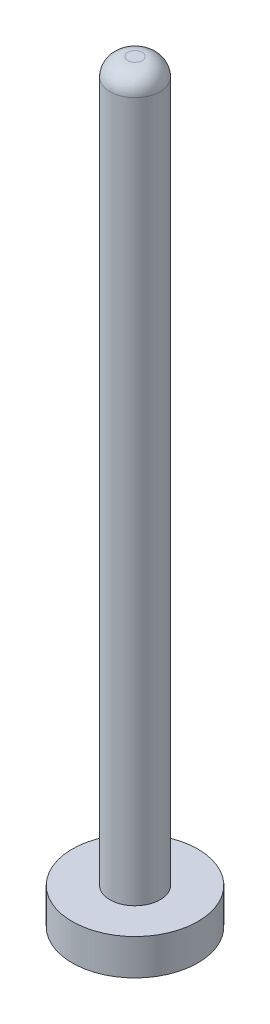
ISO-10303-21;
HEADER;
FILE_DESCRIPTION(('STEP AP214'),'2;1');
FILE_NAME('part.step','',(''),(''),'','','');
FILE_SCHEMA(('AUTOMOTIVE_DESIGN { 1 0 10303 214 1 1 1 1 }'));
ENDSEC;
DATA;
#1=APPLICATION_CONTEXT('core data for automotive mechanical design processes');
#2=APPLICATION_PROTOCOL_DEFINITION('international standard','automotive_design',2000,#1);
#3=PRODUCT_CONTEXT('',#1,'mechanical');
#4=PRODUCT('Part','Part','',(#3));
#5=PRODUCT_RELATED_PRODUCT_CATEGORY('part','',(#4));
#6=PRODUCT_DEFINITION_FORMATION('','',#4);
#7=PRODUCT_DEFINITION_CONTEXT('part definition',#1,'design');
#8=PRODUCT_DEFINITION('design','',#6,#7);
#9=PRODUCT_DEFINITION_SHAPE('','',#8);
#10=(LENGTH_UNIT() NAMED_UNIT(*) SI_UNIT(.MILLI.,.METRE.));
#11=(NAMED_UNIT(*) PLANE_ANGLE_UNIT() SI_UNIT($,.RADIAN.));
#12=(NAMED_UNIT(*) SI_UNIT($,.STERADIAN.) SOLID_ANGLE_UNIT());
#13=UNCERTAINTY_MEASURE_WITH_UNIT(LENGTH_MEASURE(1.E-05),#10,'distance_accuracy_value','');
#14=(GEOMETRIC_REPRESENTATION_CONTEXT(3) GLOBAL_UNCERTAINTY_ASSIGNED_CONTEXT((#13)) GLOBAL_UNIT_ASSIGNED_CONTEXT((#10,
#11,#12)) REPRESENTATION_CONTEXT('',''));
#15=CARTESIAN_POINT('',(0.,0.,0.));
#16=DIRECTION('',(0.,0.,1.));
#17=DIRECTION('',(1.,0.,0.));
#18=AXIS2_PLACEMENT_3D('',#15,#16,#17);
#19=CARTESIAN_POINT('',(0.,40.,0.));
#20=DIRECTION('',(0.,-1.,0.));
#21=DIRECTION('',(0.,0.,-1.));
#22=AXIS2_PLACEMENT_3D('',#19,#20,#21);
#23=CYLINDRICAL_SURFACE('',#22,1.4);
#24=CARTESIAN_POINT('',(0.,39.,0.));
#25=DIRECTION('',(0.,1.,0.));
#26=DIRECTION('',(0.,0.,1.));
#27=AXIS2_PLACEMENT_3D('',#24,#25,#26);
#28=CIRCLE('',#27,1.4);
#29=CARTESIAN_POINT('',(0.,39.,1.4));
#30=VERTEX_POINT('',#29);
#31=EDGE_CURVE('E10',#30,#30,#28,.F.);
#32=ORIENTED_EDGE('',*,*,#31,.T.);
#33=EDGE_LOOP('',(#32));
#34=FACE_BOUND('',#33,.T.);
#35=CARTESIAN_POINT('',(0.,0.,0.));
#36=DIRECTION('',(0.,1.,0.));
#37=DIRECTION('',(0.,0.,1.));
#38=AXIS2_PLACEMENT_3D('',#35,#36,#37);
#39=CIRCLE('',#38,1.4);
#40=CARTESIAN_POINT('',(0.,0.,1.4));
#41=VERTEX_POINT('',#40);
#42=EDGE_CURVE('E46',#41,#41,#39,.T.);
#43=ORIENTED_EDGE('',*,*,#42,.T.);
#44=EDGE_LOOP('',(#43));
#45=FACE_BOUND('',#44,.T.);
#46=ADVANCED_FACE('F35',(#34,#45),#23,.T.);
#47=CARTESIAN_POINT('',(0.,40.,0.));
#48=DIRECTION('',(0.,1.,0.));
#49=DIRECTION('',(0.,0.,1.));
#50=AXIS2_PLACEMENT_3D('',#47,#48,#49);
#51=PLANE('',#50);
#52=CARTESIAN_POINT('',(0.,40.,0.));
#53=DIRECTION('',(0.,1.,0.));
#54=DIRECTION('',(0.,0.,1.));
#55=AXIS2_PLACEMENT_3D('',#52,#53,#54);
#56=CIRCLE('',#55,0.4);
#57=CARTESIAN_POINT('',(0.,40.,0.4));
#58=VERTEX_POINT('',#57);
#59=EDGE_CURVE('E42',#58,#58,#56,.T.);
#60=ORIENTED_EDGE('',*,*,#59,.T.);
#61=EDGE_LOOP('',(#60));
#62=FACE_BOUND('',#61,.T.);
#63=ADVANCED_FACE('F64',(#62),#51,.T.);
#64=CARTESIAN_POINT('',(0.,-2.,0.));
#65=DIRECTION('',(0.,1.,0.));
#66=DIRECTION('',(0.,0.,1.));
#67=AXIS2_PLACEMENT_3D('',#64,#65,#66);
#68=CYLINDRICAL_SURFACE('',#67,3.5);
#69=CARTESIAN_POINT('',(0.,-2.,0.));
#70=DIRECTION('',(0.,-1.,0.));
#71=DIRECTION('',(0.,0.,-1.));
#72=AXIS2_PLACEMENT_3D('',#69,#70,#71);
#73=CIRCLE('',#72,3.5);
#74=CARTESIAN_POINT('',(0.,-2.,-3.5));
#75=VERTEX_POINT('',#74);
#76=EDGE_CURVE('E50',#75,#75,#73,.T.);
#77=ORIENTED_EDGE('',*,*,#76,.F.);
#78=EDGE_LOOP('',(#77));
#79=FACE_BOUND('',#78,.T.);
#80=CARTESIAN_POINT('',(0.,0.,0.));
#81=DIRECTION('',(0.,-1.,0.));
#82=DIRECTION('',(0.,0.,-1.));
#83=AXIS2_PLACEMENT_3D('',#80,#81,#82);
#84=CIRCLE('',#83,3.5);
#85=CARTESIAN_POINT('',(0.,0.,-3.5));
#86=VERTEX_POINT('',#85);
#87=EDGE_CURVE('E53',#86,#86,#84,.T.);
#88=ORIENTED_EDGE('',*,*,#87,.T.);
#89=EDGE_LOOP('',(#88));
#90=FACE_BOUND('',#89,.T.);
#91=ADVANCED_FACE('F61',(#79,#90),#68,.T.);
#92=CARTESIAN_POINT('',(0.,-2.,0.));
#93=DIRECTION('',(0.,-1.,0.));
#94=DIRECTION('',(0.,0.,-1.));
#95=AXIS2_PLACEMENT_3D('',#92,#93,#94);
#96=PLANE('',#95);
#97=ORIENTED_EDGE('',*,*,#76,.T.);
#98=EDGE_LOOP('',(#97));
#99=FACE_BOUND('',#98,.T.);
#100=ADVANCED_FACE('F59',(#99),#96,.T.);
#101=CARTESIAN_POINT('',(0.,0.,0.));
#102=DIRECTION('',(0.,-1.,0.));
#103=DIRECTION('',(0.,0.,-1.));
#104=AXIS2_PLACEMENT_3D('',#101,#102,#103);
#105=PLANE('',#104);
#106=ORIENTED_EDGE('',*,*,#42,.F.);
#107=EDGE_LOOP('',(#106));
#108=FACE_BOUND('',#107,.T.);
#109=ORIENTED_EDGE('',*,*,#87,.F.);
#110=EDGE_LOOP('',(#109));
#111=FACE_BOUND('',#110,.T.);
#112=ADVANCED_FACE('F68',(#108,#111),#105,.F.);
#113=CARTESIAN_POINT('',(0.,39.,0.));
#114=DIRECTION('',(0.,1.,0.));
#115=DIRECTION('',(0.,0.,1.));
#116=AXIS2_PLACEMENT_3D('',#113,#114,#115);
#117=DEGENERATE_TOROIDAL_SURFACE('',#116,0.4,1.,.T.);
#118=ORIENTED_EDGE('',*,*,#31,.F.);
#119=EDGE_LOOP('',(#118));
#120=FACE_BOUND('',#119,.T.);
#121=ORIENTED_EDGE('',*,*,#59,.F.);
#122=EDGE_LOOP('',(#121));
#123=FACE_BOUND('',#122,.T.);
#124=ADVANCED_FACE('F37',(#120,#123),#117,.T.);
#125=CLOSED_SHELL('',(#46,#63,#91,#100,#112,#124));
#126=MANIFOLD_SOLID_BREP('B2',#125);
#127=ADVANCED_BREP_SHAPE_REPRESENTATION('',(#18,#126),#14);
#128=SHAPE_DEFINITION_REPRESENTATION(#9,#127);
ENDSEC;
END-ISO-10303-21;
